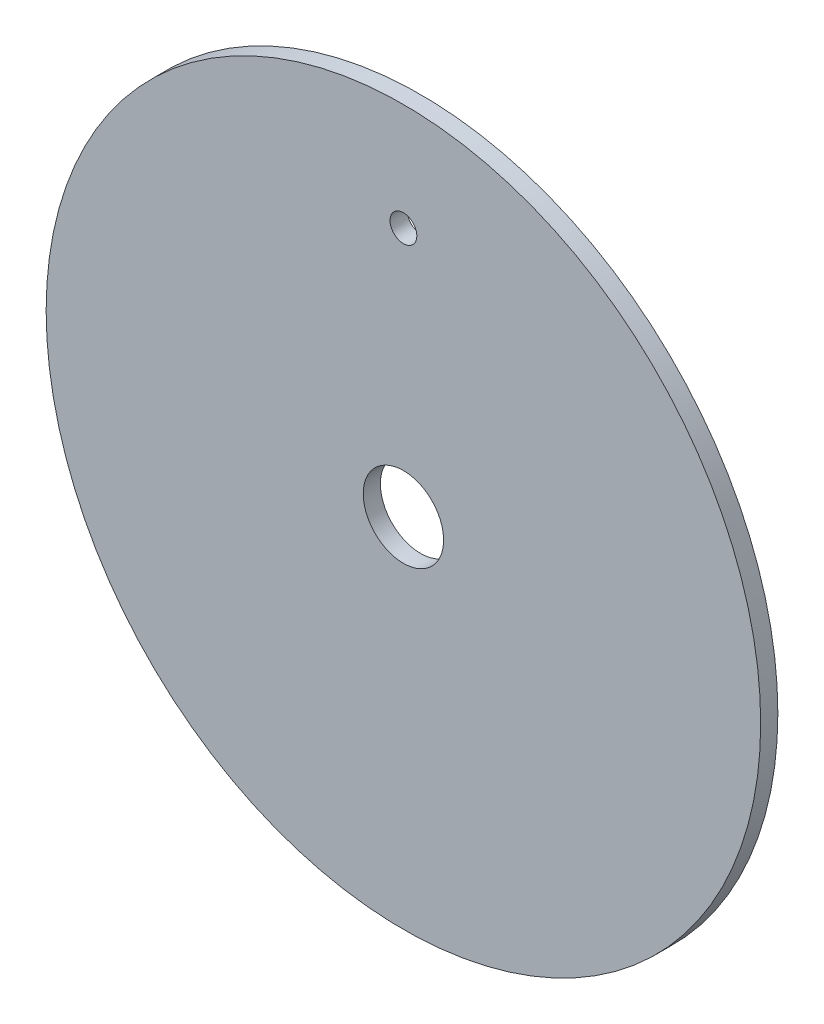
ISO-10303-21;
HEADER;
FILE_DESCRIPTION(('STEP AP214'),'2;1');
FILE_NAME('part.step','',(''),(''),'','','');
FILE_SCHEMA(('AUTOMOTIVE_DESIGN { 1 0 10303 214 1 1 1 1 }'));
ENDSEC;
DATA;
#1=APPLICATION_CONTEXT('core data for automotive mechanical design processes');
#2=APPLICATION_PROTOCOL_DEFINITION('international standard','automotive_design',2000,#1);
#3=PRODUCT_CONTEXT('',#1,'mechanical');
#4=PRODUCT('Part','Part','',(#3));
#5=PRODUCT_RELATED_PRODUCT_CATEGORY('part','',(#4));
#6=PRODUCT_DEFINITION_FORMATION('','',#4);
#7=PRODUCT_DEFINITION_CONTEXT('part definition',#1,'design');
#8=PRODUCT_DEFINITION('design','',#6,#7);
#9=PRODUCT_DEFINITION_SHAPE('','',#8);
#10=(LENGTH_UNIT() NAMED_UNIT(*) SI_UNIT(.MILLI.,.METRE.));
#11=(NAMED_UNIT(*) PLANE_ANGLE_UNIT() SI_UNIT($,.RADIAN.));
#12=(NAMED_UNIT(*) SI_UNIT($,.STERADIAN.) SOLID_ANGLE_UNIT());
#13=UNCERTAINTY_MEASURE_WITH_UNIT(LENGTH_MEASURE(1.E-05),#10,'distance_accuracy_value','');
#14=(GEOMETRIC_REPRESENTATION_CONTEXT(3) GLOBAL_UNCERTAINTY_ASSIGNED_CONTEXT((#13)) GLOBAL_UNIT_ASSIGNED_CONTEXT((#10,
#11,#12)) REPRESENTATION_CONTEXT('',''));
#15=CARTESIAN_POINT('',(0.,0.,0.));
#16=DIRECTION('',(0.,0.,1.));
#17=DIRECTION('',(1.,0.,0.));
#18=AXIS2_PLACEMENT_3D('',#15,#16,#17);
#19=CARTESIAN_POINT('',(0.,0.,3.048));
#20=DIRECTION('',(0.,0.,1.));
#21=DIRECTION('',(1.,0.,0.));
#22=AXIS2_PLACEMENT_3D('',#19,#20,#21);
#23=PLANE('',#22);
#24=CARTESIAN_POINT('',(0.,44.45,3.048));
#25=DIRECTION('',(0.,0.,1.));
#26=DIRECTION('',(1.,0.,0.));
#27=AXIS2_PLACEMENT_3D('',#24,#25,#26);
#28=CIRCLE('',#27,2.38125);
#29=CARTESIAN_POINT('',(2.38125,44.45,3.048));
#30=VERTEX_POINT('',#29);
#31=EDGE_CURVE('E62',#30,#30,#28,.T.);
#32=ORIENTED_EDGE('',*,*,#31,.F.);
#33=EDGE_LOOP('',(#32));
#34=FACE_BOUND('',#33,.T.);
#35=CARTESIAN_POINT('',(0.,0.,3.048));
#36=DIRECTION('',(0.,0.,1.));
#37=DIRECTION('',(1.,0.,0.));
#38=AXIS2_PLACEMENT_3D('',#35,#36,#37);
#39=CIRCLE('',#38,63.5);
#40=CARTESIAN_POINT('',(-63.5,0.,3.048));
#41=VERTEX_POINT('',#40);
#42=EDGE_CURVE('E10',#41,#41,#39,.T.);
#43=ORIENTED_EDGE('',*,*,#42,.T.);
#44=EDGE_LOOP('',(#43));
#45=FACE_BOUND('',#44,.T.);
#46=CARTESIAN_POINT('',(0.,0.,3.048));
#47=DIRECTION('',(0.,0.,1.));
#48=DIRECTION('',(1.,0.,0.));
#49=AXIS2_PLACEMENT_3D('',#46,#47,#48);
#50=CIRCLE('',#49,7.14375);
#51=CARTESIAN_POINT('',(-7.14375,0.,3.048));
#52=VERTEX_POINT('',#51);
#53=EDGE_CURVE('E52',#52,#52,#50,.T.);
#54=ORIENTED_EDGE('',*,*,#53,.F.);
#55=EDGE_LOOP('',(#54));
#56=FACE_BOUND('',#55,.T.);
#57=ADVANCED_FACE('F39',(#34,#45,#56),#23,.T.);
#58=CARTESIAN_POINT('',(0.,0.,0.));
#59=DIRECTION('',(0.,0.,1.));
#60=DIRECTION('',(1.,0.,0.));
#61=AXIS2_PLACEMENT_3D('',#58,#59,#60);
#62=PLANE('',#61);
#63=CARTESIAN_POINT('',(0.,44.45,0.));
#64=DIRECTION('',(0.,0.,1.));
#65=DIRECTION('',(1.,0.,0.));
#66=AXIS2_PLACEMENT_3D('',#63,#64,#65);
#67=CIRCLE('',#66,2.38125);
#68=CARTESIAN_POINT('',(2.38125,44.45,0.));
#69=VERTEX_POINT('',#68);
#70=EDGE_CURVE('E58',#69,#69,#67,.T.);
#71=ORIENTED_EDGE('',*,*,#70,.T.);
#72=EDGE_LOOP('',(#71));
#73=FACE_BOUND('',#72,.T.);
#74=CARTESIAN_POINT('',(0.,0.,0.));
#75=DIRECTION('',(0.,0.,1.));
#76=DIRECTION('',(1.,0.,0.));
#77=AXIS2_PLACEMENT_3D('',#74,#75,#76);
#78=CIRCLE('',#77,63.5);
#79=CARTESIAN_POINT('',(-63.5,0.,0.));
#80=VERTEX_POINT('',#79);
#81=EDGE_CURVE('E43',#80,#80,#78,.T.);
#82=ORIENTED_EDGE('',*,*,#81,.F.);
#83=EDGE_LOOP('',(#82));
#84=FACE_BOUND('',#83,.T.);
#85=CARTESIAN_POINT('',(0.,0.,0.));
#86=DIRECTION('',(0.,0.,1.));
#87=DIRECTION('',(1.,0.,0.));
#88=AXIS2_PLACEMENT_3D('',#85,#86,#87);
#89=CIRCLE('',#88,7.14375);
#90=CARTESIAN_POINT('',(-7.14375,0.,0.));
#91=VERTEX_POINT('',#90);
#92=EDGE_CURVE('E54',#91,#91,#89,.T.);
#93=ORIENTED_EDGE('',*,*,#92,.T.);
#94=EDGE_LOOP('',(#93));
#95=FACE_BOUND('',#94,.T.);
#96=ADVANCED_FACE('F70',(#73,#84,#95),#62,.F.);
#97=CARTESIAN_POINT('',(0.,0.,3.048));
#98=DIRECTION('',(0.,0.,-1.));
#99=DIRECTION('',(-1.,0.,0.));
#100=AXIS2_PLACEMENT_3D('',#97,#98,#99);
#101=CYLINDRICAL_SURFACE('',#100,63.5);
#102=CARTESIAN_POINT('',(-63.5,0.,3.048));
#103=CARTESIAN_POINT('',(-63.5,0.,3.01625));
#104=CARTESIAN_POINT('',(-63.5,0.,2.9845));
#105=CARTESIAN_POINT('',(-63.5,0.,2.921));
#106=CARTESIAN_POINT('',(-63.5,0.,2.88925));
#107=CARTESIAN_POINT('',(-63.5,0.,2.82575));
#108=CARTESIAN_POINT('',(-63.5,0.,2.794));
#109=CARTESIAN_POINT('',(-63.5,0.,2.7305));
#110=CARTESIAN_POINT('',(-63.5,0.,2.69875));
#111=CARTESIAN_POINT('',(-63.5,0.,2.63525));
#112=CARTESIAN_POINT('',(-63.5,0.,2.6035));
#113=CARTESIAN_POINT('',(-63.5,0.,2.54));
#114=CARTESIAN_POINT('',(-63.5,0.,2.50825));
#115=CARTESIAN_POINT('',(-63.5,0.,2.44475));
#116=CARTESIAN_POINT('',(-63.5,0.,2.413));
#117=CARTESIAN_POINT('',(-63.5,0.,2.3495));
#118=CARTESIAN_POINT('',(-63.5,0.,2.31775));
#119=CARTESIAN_POINT('',(-63.5,0.,2.25425));
#120=CARTESIAN_POINT('',(-63.5,0.,2.2225));
#121=CARTESIAN_POINT('',(-63.5,0.,2.159));
#122=CARTESIAN_POINT('',(-63.5,0.,2.12725));
#123=CARTESIAN_POINT('',(-63.5,0.,2.06375));
#124=CARTESIAN_POINT('',(-63.5,0.,2.032));
#125=CARTESIAN_POINT('',(-63.5,0.,1.9685));
#126=CARTESIAN_POINT('',(-63.5,0.,1.93675));
#127=CARTESIAN_POINT('',(-63.5,0.,1.87325));
#128=CARTESIAN_POINT('',(-63.5,0.,1.8415));
#129=CARTESIAN_POINT('',(-63.5,0.,1.778));
#130=CARTESIAN_POINT('',(-63.5,0.,1.74625));
#131=CARTESIAN_POINT('',(-63.5,0.,1.68275));
#132=CARTESIAN_POINT('',(-63.5,0.,1.651));
#133=CARTESIAN_POINT('',(-63.5,0.,1.5875));
#134=CARTESIAN_POINT('',(-63.5,0.,1.55575));
#135=CARTESIAN_POINT('',(-63.5,0.,1.49225));
#136=CARTESIAN_POINT('',(-63.5,0.,1.4605));
#137=CARTESIAN_POINT('',(-63.5,0.,1.397));
#138=CARTESIAN_POINT('',(-63.5,0.,1.36525));
#139=CARTESIAN_POINT('',(-63.5,0.,1.30175));
#140=CARTESIAN_POINT('',(-63.5,0.,1.27));
#141=CARTESIAN_POINT('',(-63.5,0.,1.2065));
#142=CARTESIAN_POINT('',(-63.5,0.,1.17475));
#143=CARTESIAN_POINT('',(-63.5,0.,1.11125));
#144=CARTESIAN_POINT('',(-63.5,0.,1.0795));
#145=CARTESIAN_POINT('',(-63.5,0.,1.016));
#146=CARTESIAN_POINT('',(-63.5,0.,0.98425));
#147=CARTESIAN_POINT('',(-63.5,0.,0.92075));
#148=CARTESIAN_POINT('',(-63.5,0.,0.889));
#149=CARTESIAN_POINT('',(-63.5,0.,0.8255));
#150=CARTESIAN_POINT('',(-63.5,0.,0.79375));
#151=CARTESIAN_POINT('',(-63.5,0.,0.73025));
#152=CARTESIAN_POINT('',(-63.5,0.,0.6985));
#153=CARTESIAN_POINT('',(-63.5,0.,0.635));
#154=CARTESIAN_POINT('',(-63.5,0.,0.60325));
#155=CARTESIAN_POINT('',(-63.5,0.,0.53975));
#156=CARTESIAN_POINT('',(-63.5,0.,0.508));
#157=CARTESIAN_POINT('',(-63.5,0.,0.4445));
#158=CARTESIAN_POINT('',(-63.5,0.,0.41275));
#159=CARTESIAN_POINT('',(-63.5,0.,0.34925));
#160=CARTESIAN_POINT('',(-63.5,0.,0.3175));
#161=CARTESIAN_POINT('',(-63.5,0.,0.254));
#162=CARTESIAN_POINT('',(-63.5,0.,0.22225));
#163=CARTESIAN_POINT('',(-63.5,0.,0.15875));
#164=CARTESIAN_POINT('',(-63.5,0.,0.127));
#165=CARTESIAN_POINT('',(-63.5,0.,0.0634999999999999));
#166=CARTESIAN_POINT('',(-63.5,0.,0.03175));
#167=CARTESIAN_POINT('',(-63.5,0.,0.));
#168=B_SPLINE_CURVE_WITH_KNOTS('',3,(#102,#103,#104,#105,#106,#107,#108,#109,#110,#111,#112,
#113,#114,#115,#116,#117,#118,#119,#120,#121,#122,#123,#124,#125,#126,#127,#128,#129,#130,#131,
#132,#133,#134,#135,#136,#137,#138,#139,#140,#141,#142,#143,#144,#145,#146,#147,#148,#149,#150,
#151,#152,#153,#154,#155,#156,#157,#158,#159,#160,#161,#162,#163,#164,#165,#166,#167),
.UNSPECIFIED.,.F.,.F.,(4,2,2,2,2,2,2,2,2,2,2,2,2,2,2,2,2,2,2,2,2,2,2,2,2,2,2,2,2,2,2,2,4),(0.,
0.0952500000000003,0.1905,0.28575,0.381,0.47625,0.5715,0.66675,0.762,0.85725,0.9525,1.04775,
1.143,1.23825,1.3335,1.42875,1.524,1.61925,1.7145,1.80975,1.905,2.00025,2.0955,2.19075,2.286,
2.38125,2.4765,2.57175,2.667,2.76225,2.8575,2.95275,3.048),.UNSPECIFIED.);
#169=EDGE_CURVE('BSEAM41',#41,#80,#168,.T.);
#170=ORIENTED_EDGE('',*,*,#42,.F.);
#171=ORIENTED_EDGE('',*,*,#81,.T.);
#172=ORIENTED_EDGE('',*,*,#169,.T.);
#173=ORIENTED_EDGE('',*,*,#169,.F.);
#174=EDGE_LOOP('',(#170,#172,#171,#173));
#175=FACE_BOUND('',#174,.T.);
#176=ADVANCED_FACE('F41',(#175),#101,.T.);
#177=CARTESIAN_POINT('',(0.,0.,3.048));
#178=DIRECTION('',(0.,0.,-1.));
#179=DIRECTION('',(-1.,0.,0.));
#180=AXIS2_PLACEMENT_3D('',#177,#178,#179);
#181=CYLINDRICAL_SURFACE('',#180,7.14375);
#182=CARTESIAN_POINT('',(-7.14375,0.,3.048));
#183=CARTESIAN_POINT('',(-7.14375,0.,3.01625));
#184=CARTESIAN_POINT('',(-7.14375,0.,2.9845));
#185=CARTESIAN_POINT('',(-7.14375,0.,2.921));
#186=CARTESIAN_POINT('',(-7.14375,0.,2.88925));
#187=CARTESIAN_POINT('',(-7.14375,0.,2.82575));
#188=CARTESIAN_POINT('',(-7.14375,0.,2.794));
#189=CARTESIAN_POINT('',(-7.14375,0.,2.7305));
#190=CARTESIAN_POINT('',(-7.14375,0.,2.69875));
#191=CARTESIAN_POINT('',(-7.14375,0.,2.63525));
#192=CARTESIAN_POINT('',(-7.14375,0.,2.6035));
#193=CARTESIAN_POINT('',(-7.14375,0.,2.54));
#194=CARTESIAN_POINT('',(-7.14375,0.,2.50825));
#195=CARTESIAN_POINT('',(-7.14375,0.,2.44475));
#196=CARTESIAN_POINT('',(-7.14375,0.,2.413));
#197=CARTESIAN_POINT('',(-7.14375,0.,2.3495));
#198=CARTESIAN_POINT('',(-7.14375,0.,2.31775));
#199=CARTESIAN_POINT('',(-7.14375,0.,2.25425));
#200=CARTESIAN_POINT('',(-7.14375,0.,2.2225));
#201=CARTESIAN_POINT('',(-7.14375,0.,2.159));
#202=CARTESIAN_POINT('',(-7.14375,0.,2.12725));
#203=CARTESIAN_POINT('',(-7.14375,0.,2.06375));
#204=CARTESIAN_POINT('',(-7.14375,0.,2.032));
#205=CARTESIAN_POINT('',(-7.14375,0.,1.9685));
#206=CARTESIAN_POINT('',(-7.14375,0.,1.93675));
#207=CARTESIAN_POINT('',(-7.14375,0.,1.87325));
#208=CARTESIAN_POINT('',(-7.14375,0.,1.8415));
#209=CARTESIAN_POINT('',(-7.14375,0.,1.778));
#210=CARTESIAN_POINT('',(-7.14375,0.,1.74625));
#211=CARTESIAN_POINT('',(-7.14375,0.,1.68275));
#212=CARTESIAN_POINT('',(-7.14375,0.,1.651));
#213=CARTESIAN_POINT('',(-7.14375,0.,1.5875));
#214=CARTESIAN_POINT('',(-7.14375,0.,1.55575));
#215=CARTESIAN_POINT('',(-7.14375,0.,1.49225));
#216=CARTESIAN_POINT('',(-7.14375,0.,1.4605));
#217=CARTESIAN_POINT('',(-7.14375,0.,1.397));
#218=CARTESIAN_POINT('',(-7.14375,0.,1.36525));
#219=CARTESIAN_POINT('',(-7.14375,0.,1.30175));
#220=CARTESIAN_POINT('',(-7.14375,0.,1.27));
#221=CARTESIAN_POINT('',(-7.14375,0.,1.2065));
#222=CARTESIAN_POINT('',(-7.14375,0.,1.17475));
#223=CARTESIAN_POINT('',(-7.14375,0.,1.11125));
#224=CARTESIAN_POINT('',(-7.14375,0.,1.0795));
#225=CARTESIAN_POINT('',(-7.14375,0.,1.016));
#226=CARTESIAN_POINT('',(-7.14375,0.,0.98425));
#227=CARTESIAN_POINT('',(-7.14375,0.,0.92075));
#228=CARTESIAN_POINT('',(-7.14375,0.,0.889));
#229=CARTESIAN_POINT('',(-7.14375,0.,0.8255));
#230=CARTESIAN_POINT('',(-7.14375,0.,0.79375));
#231=CARTESIAN_POINT('',(-7.14375,0.,0.73025));
#232=CARTESIAN_POINT('',(-7.14375,0.,0.6985));
#233=CARTESIAN_POINT('',(-7.14375,0.,0.635));
#234=CARTESIAN_POINT('',(-7.14375,0.,0.60325));
#235=CARTESIAN_POINT('',(-7.14375,0.,0.53975));
#236=CARTESIAN_POINT('',(-7.14375,0.,0.508));
#237=CARTESIAN_POINT('',(-7.14375,0.,0.4445));
#238=CARTESIAN_POINT('',(-7.14375,0.,0.41275));
#239=CARTESIAN_POINT('',(-7.14375,0.,0.34925));
#240=CARTESIAN_POINT('',(-7.14375,0.,0.3175));
#241=CARTESIAN_POINT('',(-7.14375,0.,0.254));
#242=CARTESIAN_POINT('',(-7.14375,0.,0.22225));
#243=CARTESIAN_POINT('',(-7.14375,0.,0.15875));
#244=CARTESIAN_POINT('',(-7.14375,0.,0.127));
#245=CARTESIAN_POINT('',(-7.14375,0.,0.0634999999999999));
#246=CARTESIAN_POINT('',(-7.14375,0.,0.03175));
#247=CARTESIAN_POINT('',(-7.14375,0.,0.));
#248=B_SPLINE_CURVE_WITH_KNOTS('',3,(#182,#183,#184,#185,#186,#187,#188,#189,#190,#191,#192,
#193,#194,#195,#196,#197,#198,#199,#200,#201,#202,#203,#204,#205,#206,#207,#208,#209,#210,#211,
#212,#213,#214,#215,#216,#217,#218,#219,#220,#221,#222,#223,#224,#225,#226,#227,#228,#229,#230,
#231,#232,#233,#234,#235,#236,#237,#238,#239,#240,#241,#242,#243,#244,#245,#246,#247),
.UNSPECIFIED.,.F.,.F.,(4,2,2,2,2,2,2,2,2,2,2,2,2,2,2,2,2,2,2,2,2,2,2,2,2,2,2,2,2,2,2,2,4),(0.,
0.0952499999999998,0.1905,0.28575,0.381,0.47625,0.5715,0.66675,0.762,0.85725,0.9525,1.04775,
1.143,1.23825,1.3335,1.42875,1.524,1.61925,1.7145,1.80975,1.905,2.00025,2.0955,2.19075,2.286,
2.38125,2.4765,2.57175,2.667,2.76225,2.8575,2.95275,3.048),.UNSPECIFIED.);
#249=EDGE_CURVE('BSEAM76',#52,#91,#248,.T.);
#250=ORIENTED_EDGE('',*,*,#53,.T.);
#251=ORIENTED_EDGE('',*,*,#92,.F.);
#252=ORIENTED_EDGE('',*,*,#249,.T.);
#253=ORIENTED_EDGE('',*,*,#249,.F.);
#254=EDGE_LOOP('',(#250,#252,#251,#253));
#255=FACE_BOUND('',#254,.T.);
#256=ADVANCED_FACE('F76',(#255),#181,.F.);
#257=CARTESIAN_POINT('',(0.,44.45,0.));
#258=DIRECTION('',(0.,0.,1.));
#259=DIRECTION('',(1.,0.,0.));
#260=AXIS2_PLACEMENT_3D('',#257,#258,#259);
#261=CYLINDRICAL_SURFACE('',#260,2.38125);
#262=CARTESIAN_POINT('',(2.38125,44.45,0.));
#263=CARTESIAN_POINT('',(2.38125,44.45,0.03175));
#264=CARTESIAN_POINT('',(2.38125,44.45,0.0635));
#265=CARTESIAN_POINT('',(2.38125,44.45,0.127));
#266=CARTESIAN_POINT('',(2.38125,44.45,0.15875));
#267=CARTESIAN_POINT('',(2.38125,44.45,0.22225));
#268=CARTESIAN_POINT('',(2.38125,44.45,0.254));
#269=CARTESIAN_POINT('',(2.38125,44.45,0.3175));
#270=CARTESIAN_POINT('',(2.38125,44.45,0.34925));
#271=CARTESIAN_POINT('',(2.38125,44.45,0.41275));
#272=CARTESIAN_POINT('',(2.38125,44.45,0.4445));
#273=CARTESIAN_POINT('',(2.38125,44.45,0.508));
#274=CARTESIAN_POINT('',(2.38125,44.45,0.53975));
#275=CARTESIAN_POINT('',(2.38125,44.45,0.60325));
#276=CARTESIAN_POINT('',(2.38125,44.45,0.635));
#277=CARTESIAN_POINT('',(2.38125,44.45,0.6985));
#278=CARTESIAN_POINT('',(2.38125,44.45,0.73025));
#279=CARTESIAN_POINT('',(2.38125,44.45,0.79375));
#280=CARTESIAN_POINT('',(2.38125,44.45,0.8255));
#281=CARTESIAN_POINT('',(2.38125,44.45,0.889));
#282=CARTESIAN_POINT('',(2.38125,44.45,0.92075));
#283=CARTESIAN_POINT('',(2.38125,44.45,0.98425));
#284=CARTESIAN_POINT('',(2.38125,44.45,1.016));
#285=CARTESIAN_POINT('',(2.38125,44.45,1.0795));
#286=CARTESIAN_POINT('',(2.38125,44.45,1.11125));
#287=CARTESIAN_POINT('',(2.38125,44.45,1.17475));
#288=CARTESIAN_POINT('',(2.38125,44.45,1.2065));
#289=CARTESIAN_POINT('',(2.38125,44.45,1.27));
#290=CARTESIAN_POINT('',(2.38125,44.45,1.30175));
#291=CARTESIAN_POINT('',(2.38125,44.45,1.36525));
#292=CARTESIAN_POINT('',(2.38125,44.45,1.397));
#293=CARTESIAN_POINT('',(2.38125,44.45,1.4605));
#294=CARTESIAN_POINT('',(2.38125,44.45,1.49225));
#295=CARTESIAN_POINT('',(2.38125,44.45,1.55575));
#296=CARTESIAN_POINT('',(2.38125,44.45,1.5875));
#297=CARTESIAN_POINT('',(2.38125,44.45,1.651));
#298=CARTESIAN_POINT('',(2.38125,44.45,1.68275));
#299=CARTESIAN_POINT('',(2.38125,44.45,1.74625));
#300=CARTESIAN_POINT('',(2.38125,44.45,1.778));
#301=CARTESIAN_POINT('',(2.38125,44.45,1.8415));
#302=CARTESIAN_POINT('',(2.38125,44.45,1.87325));
#303=CARTESIAN_POINT('',(2.38125,44.45,1.93675));
#304=CARTESIAN_POINT('',(2.38125,44.45,1.9685));
#305=CARTESIAN_POINT('',(2.38125,44.45,2.032));
#306=CARTESIAN_POINT('',(2.38125,44.45,2.06375));
#307=CARTESIAN_POINT('',(2.38125,44.45,2.12725));
#308=CARTESIAN_POINT('',(2.38125,44.45,2.159));
#309=CARTESIAN_POINT('',(2.38125,44.45,2.2225));
#310=CARTESIAN_POINT('',(2.38125,44.45,2.25425));
#311=CARTESIAN_POINT('',(2.38125,44.45,2.31775));
#312=CARTESIAN_POINT('',(2.38125,44.45,2.3495));
#313=CARTESIAN_POINT('',(2.38125,44.45,2.413));
#314=CARTESIAN_POINT('',(2.38125,44.45,2.44475));
#315=CARTESIAN_POINT('',(2.38125,44.45,2.50825));
#316=CARTESIAN_POINT('',(2.38125,44.45,2.54));
#317=CARTESIAN_POINT('',(2.38125,44.45,2.6035));
#318=CARTESIAN_POINT('',(2.38125,44.45,2.63525));
#319=CARTESIAN_POINT('',(2.38125,44.45,2.69875));
#320=CARTESIAN_POINT('',(2.38125,44.45,2.7305));
#321=CARTESIAN_POINT('',(2.38125,44.45,2.794));
#322=CARTESIAN_POINT('',(2.38125,44.45,2.82575));
#323=CARTESIAN_POINT('',(2.38125,44.45,2.88925));
#324=CARTESIAN_POINT('',(2.38125,44.45,2.921));
#325=CARTESIAN_POINT('',(2.38125,44.45,2.9845));
#326=CARTESIAN_POINT('',(2.38125,44.45,3.01625));
#327=CARTESIAN_POINT('',(2.38125,44.45,3.048));
#328=B_SPLINE_CURVE_WITH_KNOTS('',3,(#262,#263,#264,#265,#266,#267,#268,#269,#270,#271,#272,
#273,#274,#275,#276,#277,#278,#279,#280,#281,#282,#283,#284,#285,#286,#287,#288,#289,#290,#291,
#292,#293,#294,#295,#296,#297,#298,#299,#300,#301,#302,#303,#304,#305,#306,#307,#308,#309,#310,
#311,#312,#313,#314,#315,#316,#317,#318,#319,#320,#321,#322,#323,#324,#325,#326,#327),
.UNSPECIFIED.,.F.,.F.,(4,2,2,2,2,2,2,2,2,2,2,2,2,2,2,2,2,2,2,2,2,2,2,2,2,2,2,2,2,2,2,2,4),(0.,
0.09525,0.1905,0.28575,0.381,0.47625,0.5715,0.66675,0.762,0.85725,0.9525,1.04775,1.143,1.23825,
1.3335,1.42875,1.524,1.61925,1.7145,1.80975,1.905,2.00025,2.0955,2.19075,2.286,2.38125,2.4765,
2.57175,2.667,2.76225,2.8575,2.95275,3.048),.UNSPECIFIED.);
#329=EDGE_CURVE('BSEAM73',#69,#30,#328,.T.);
#330=ORIENTED_EDGE('',*,*,#70,.F.);
#331=ORIENTED_EDGE('',*,*,#31,.T.);
#332=ORIENTED_EDGE('',*,*,#329,.T.);
#333=ORIENTED_EDGE('',*,*,#329,.F.);
#334=EDGE_LOOP('',(#330,#332,#331,#333));
#335=FACE_BOUND('',#334,.T.);
#336=ADVANCED_FACE('F73',(#335),#261,.F.);
#337=CLOSED_SHELL('',(#57,#96,#176,#256,#336));
#338=MANIFOLD_SOLID_BREP('B2',#337);
#339=ADVANCED_BREP_SHAPE_REPRESENTATION('',(#18,#338),#14);
#340=SHAPE_DEFINITION_REPRESENTATION(#9,#339);
ENDSEC;
END-ISO-10303-21;
